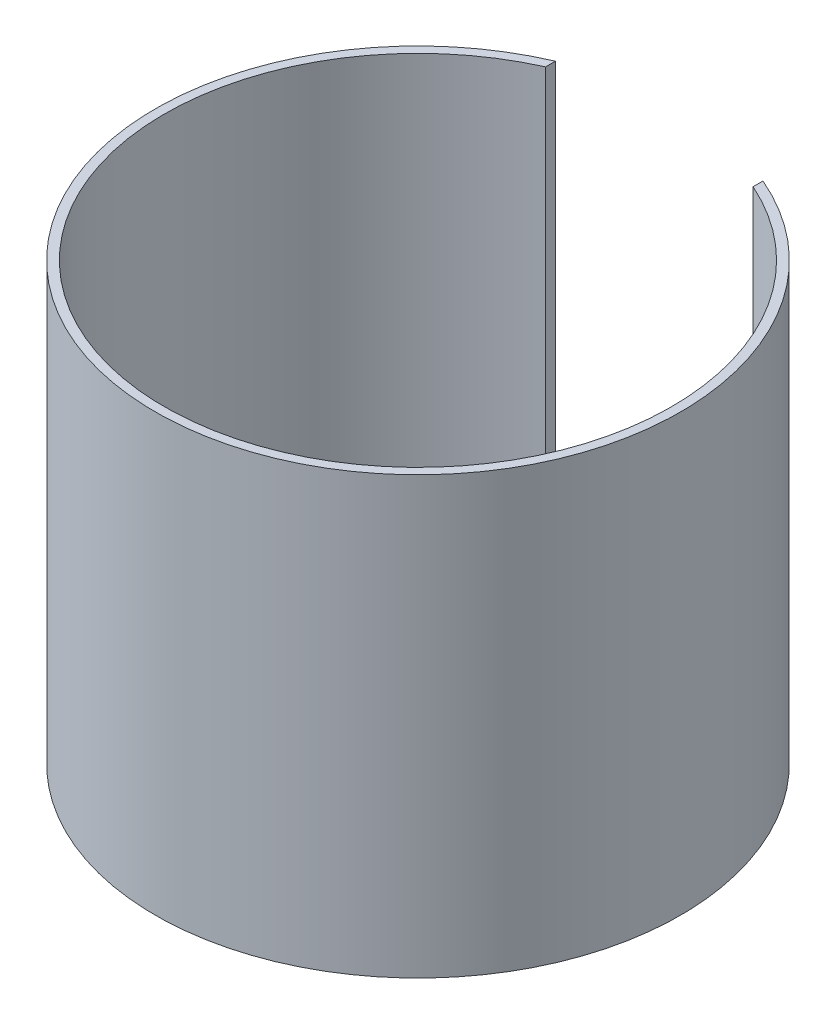
ISO-10303-21;
HEADER;
FILE_DESCRIPTION(('STEP AP214'),'2;1');
FILE_NAME('part.step','',(''),(''),'','','');
FILE_SCHEMA(('AUTOMOTIVE_DESIGN { 1 0 10303 214 1 1 1 1 }'));
ENDSEC;
DATA;
#1=APPLICATION_CONTEXT('core data for automotive mechanical design processes');
#2=APPLICATION_PROTOCOL_DEFINITION('international standard','automotive_design',2000,#1);
#3=PRODUCT_CONTEXT('',#1,'mechanical');
#4=PRODUCT('Part','Part','',(#3));
#5=PRODUCT_RELATED_PRODUCT_CATEGORY('part','',(#4));
#6=PRODUCT_DEFINITION_FORMATION('','',#4);
#7=PRODUCT_DEFINITION_CONTEXT('part definition',#1,'design');
#8=PRODUCT_DEFINITION('design','',#6,#7);
#9=PRODUCT_DEFINITION_SHAPE('','',#8);
#10=(LENGTH_UNIT() NAMED_UNIT(*) SI_UNIT(.MILLI.,.METRE.));
#11=(NAMED_UNIT(*) PLANE_ANGLE_UNIT() SI_UNIT($,.RADIAN.));
#12=(NAMED_UNIT(*) SI_UNIT($,.STERADIAN.) SOLID_ANGLE_UNIT());
#13=UNCERTAINTY_MEASURE_WITH_UNIT(LENGTH_MEASURE(1.E-05),#10,'distance_accuracy_value','');
#14=(GEOMETRIC_REPRESENTATION_CONTEXT(3) GLOBAL_UNCERTAINTY_ASSIGNED_CONTEXT((#13)) GLOBAL_UNIT_ASSIGNED_CONTEXT((#10,
#11,#12)) REPRESENTATION_CONTEXT('',''));
#15=CARTESIAN_POINT('',(0.,0.,0.));
#16=DIRECTION('',(0.,0.,1.));
#17=DIRECTION('',(1.,0.,0.));
#18=AXIS2_PLACEMENT_3D('',#15,#16,#17);
#19=CARTESIAN_POINT('',(-43.2952989304657,49.,-2.03228128460686));
#20=DIRECTION('',(0.,1.,0.));
#21=DIRECTION('',(0.,0.,1.));
#22=AXIS2_PLACEMENT_3D('',#19,#20,#21);
#23=PLANE('',#22);
#24=DIRECTION('',(0.,0.,1.));
#25=VECTOR('',#24,1.);
#26=CARTESIAN_POINT('',(-54.9612989304657,49.,-47.));
#27=LINE('',#26,#25);
#28=CARTESIAN_POINT('',(-54.9612989304657,49.,-29.1515166720583));
#29=VERTEX_POINT('',#28);
#30=CARTESIAN_POINT('',(-54.9612989304657,49.,-28.0418272245113));
#31=VERTEX_POINT('',#30);
#32=EDGE_CURVE('E54',#29,#31,#27,.T.);
#33=ORIENTED_EDGE('',*,*,#32,.F.);
#34=CARTESIAN_POINT('',(-43.2952989304657,49.,-2.03228128460686));
#35=DIRECTION('',(0.,1.,0.));
#36=DIRECTION('',(0.,0.,1.));
#37=AXIS2_PLACEMENT_3D('',#34,#35,#36);
#38=CIRCLE('',#37,29.522);
#39=CARTESIAN_POINT('',(-31.6292989304657,49.,-29.1515166720583));
#40=VERTEX_POINT('',#39);
#41=EDGE_CURVE('E85',#29,#40,#38,.T.);
#42=ORIENTED_EDGE('',*,*,#41,.T.);
#43=DIRECTION('',(0.,0.,1.));
#44=VECTOR('',#43,1.);
#45=CARTESIAN_POINT('',(-31.6292989304657,49.,-47.));
#46=LINE('',#45,#44);
#47=CARTESIAN_POINT('',(-31.6292989304657,49.,-28.0418272245113));
#48=VERTEX_POINT('',#47);
#49=EDGE_CURVE('E98',#40,#48,#46,.T.);
#50=ORIENTED_EDGE('',*,*,#49,.T.);
#51=CARTESIAN_POINT('',(-43.2952989304657,49.,-2.03228128460686));
#52=DIRECTION('',(0.,1.,0.));
#53=DIRECTION('',(0.,0.,1.));
#54=AXIS2_PLACEMENT_3D('',#51,#52,#53);
#55=CIRCLE('',#54,28.506);
#56=EDGE_CURVE('E90',#31,#48,#55,.T.);
#57=ORIENTED_EDGE('',*,*,#56,.F.);
#58=EDGE_LOOP('',(#33,#42,#50,#57));
#59=FACE_BOUND('',#58,.T.);
#60=ADVANCED_FACE('F32',(#59),#23,.T.);
#61=CARTESIAN_POINT('',(-43.2952989304657,0.,-2.03228128460686));
#62=DIRECTION('',(0.,1.,0.));
#63=DIRECTION('',(0.,0.,1.));
#64=AXIS2_PLACEMENT_3D('',#61,#62,#63);
#65=PLANE('',#64);
#66=CARTESIAN_POINT('',(-43.2952989304657,0.,-2.03228128460686));
#67=DIRECTION('',(0.,1.,0.));
#68=DIRECTION('',(0.,0.,1.));
#69=AXIS2_PLACEMENT_3D('',#66,#67,#68);
#70=CIRCLE('',#69,29.522);
#71=CARTESIAN_POINT('',(-54.9612989304657,0.,-29.1515166720583));
#72=VERTEX_POINT('',#71);
#73=CARTESIAN_POINT('',(-31.6292989304657,0.,-29.1515166720583));
#74=VERTEX_POINT('',#73);
#75=EDGE_CURVE('E83',#72,#74,#70,.T.);
#76=ORIENTED_EDGE('',*,*,#75,.F.);
#77=DIRECTION('',(0.,0.,1.));
#78=VECTOR('',#77,1.);
#79=CARTESIAN_POINT('',(-54.9612989304657,0.,-47.));
#80=LINE('',#79,#78);
#81=CARTESIAN_POINT('',(-54.9612989304657,0.,-28.0418272245113));
#82=VERTEX_POINT('',#81);
#83=EDGE_CURVE('E70',#72,#82,#80,.T.);
#84=ORIENTED_EDGE('',*,*,#83,.T.);
#85=CARTESIAN_POINT('',(-43.2952989304657,0.,-2.03228128460686));
#86=DIRECTION('',(0.,1.,0.));
#87=DIRECTION('',(0.,0.,1.));
#88=AXIS2_PLACEMENT_3D('',#85,#86,#87);
#89=CIRCLE('',#88,28.506);
#90=CARTESIAN_POINT('',(-31.6292989304657,0.,-28.0418272245113));
#91=VERTEX_POINT('',#90);
#92=EDGE_CURVE('E86',#82,#91,#89,.T.);
#93=ORIENTED_EDGE('',*,*,#92,.T.);
#94=DIRECTION('',(0.,0.,1.));
#95=VECTOR('',#94,1.);
#96=CARTESIAN_POINT('',(-31.6292989304657,0.,-47.));
#97=LINE('',#96,#95);
#98=EDGE_CURVE('E47',#74,#91,#97,.T.);
#99=ORIENTED_EDGE('',*,*,#98,.F.);
#100=EDGE_LOOP('',(#76,#84,#93,#99));
#101=FACE_BOUND('',#100,.T.);
#102=ADVANCED_FACE('F89',(#101),#65,.F.);
#103=CARTESIAN_POINT('',(-43.2952989304657,49.,-2.03228128460686));
#104=DIRECTION('',(0.,-1.,0.));
#105=DIRECTION('',(0.,0.,-1.));
#106=AXIS2_PLACEMENT_3D('',#103,#104,#105);
#107=CYLINDRICAL_SURFACE('',#106,29.522);
#108=ORIENTED_EDGE('',*,*,#41,.F.);
#109=DIRECTION('',(0.,-1.,0.));
#110=VECTOR('',#109,1.);
#111=CARTESIAN_POINT('',(-54.9612989304657,49.,-29.1515166720583));
#112=LINE('',#111,#110);
#113=EDGE_CURVE('E73',#29,#72,#112,.T.);
#114=ORIENTED_EDGE('',*,*,#113,.T.);
#115=ORIENTED_EDGE('',*,*,#75,.T.);
#116=DIRECTION('',(0.,-1.,0.));
#117=VECTOR('',#116,1.);
#118=CARTESIAN_POINT('',(-31.6292989304657,49.,-29.1515166720583));
#119=LINE('',#118,#117);
#120=EDGE_CURVE('E87',#74,#40,#119,.F.);
#121=ORIENTED_EDGE('',*,*,#120,.T.);
#122=EDGE_LOOP('',(#108,#114,#115,#121));
#123=FACE_BOUND('',#122,.T.);
#124=ADVANCED_FACE('F34',(#123),#107,.T.);
#125=CARTESIAN_POINT('',(-43.2952989304657,49.,-2.03228128460686));
#126=DIRECTION('',(0.,-1.,0.));
#127=DIRECTION('',(0.,0.,-1.));
#128=AXIS2_PLACEMENT_3D('',#125,#126,#127);
#129=CYLINDRICAL_SURFACE('',#128,28.506);
#130=DIRECTION('',(0.,-1.,0.));
#131=VECTOR('',#130,1.);
#132=CARTESIAN_POINT('',(-54.9612989304657,49.,-28.0418272245113));
#133=LINE('',#132,#131);
#134=EDGE_CURVE('E11',#31,#82,#133,.T.);
#135=ORIENTED_EDGE('',*,*,#134,.F.);
#136=ORIENTED_EDGE('',*,*,#56,.T.);
#137=DIRECTION('',(0.,-1.,0.));
#138=VECTOR('',#137,1.);
#139=CARTESIAN_POINT('',(-31.6292989304657,49.,-28.0418272245113));
#140=LINE('',#139,#138);
#141=EDGE_CURVE('E40',#91,#48,#140,.F.);
#142=ORIENTED_EDGE('',*,*,#141,.F.);
#143=ORIENTED_EDGE('',*,*,#92,.F.);
#144=EDGE_LOOP('',(#135,#136,#142,#143));
#145=FACE_BOUND('',#144,.T.);
#146=ADVANCED_FACE('F103',(#145),#129,.F.);
#147=CARTESIAN_POINT('',(-31.6292989304657,49.,-47.));
#148=DIRECTION('',(1.,0.,0.));
#149=DIRECTION('',(0.,0.,-1.));
#150=AXIS2_PLACEMENT_3D('',#147,#148,#149);
#151=PLANE('',#150);
#152=ORIENTED_EDGE('',*,*,#98,.T.);
#153=ORIENTED_EDGE('',*,*,#141,.T.);
#154=ORIENTED_EDGE('',*,*,#49,.F.);
#155=ORIENTED_EDGE('',*,*,#120,.F.);
#156=EDGE_LOOP('',(#152,#153,#154,#155));
#157=FACE_BOUND('',#156,.T.);
#158=ADVANCED_FACE('F97',(#157),#151,.F.);
#159=CARTESIAN_POINT('',(-54.9612989304657,19.5,-47.));
#160=DIRECTION('',(-1.,0.,0.));
#161=DIRECTION('',(0.,0.,1.));
#162=AXIS2_PLACEMENT_3D('',#159,#160,#161);
#163=PLANE('',#162);
#164=ORIENTED_EDGE('',*,*,#32,.T.);
#165=ORIENTED_EDGE('',*,*,#134,.T.);
#166=ORIENTED_EDGE('',*,*,#83,.F.);
#167=ORIENTED_EDGE('',*,*,#113,.F.);
#168=EDGE_LOOP('',(#164,#165,#166,#167));
#169=FACE_BOUND('',#168,.T.);
#170=ADVANCED_FACE('F72',(#169),#163,.F.);
#171=CLOSED_SHELL('',(#60,#102,#124,#146,#158,#170));
#172=MANIFOLD_SOLID_BREP('B2',#171);
#173=ADVANCED_BREP_SHAPE_REPRESENTATION('',(#18,#172),#14);
#174=SHAPE_DEFINITION_REPRESENTATION(#9,#173);
ENDSEC;
END-ISO-10303-21;
